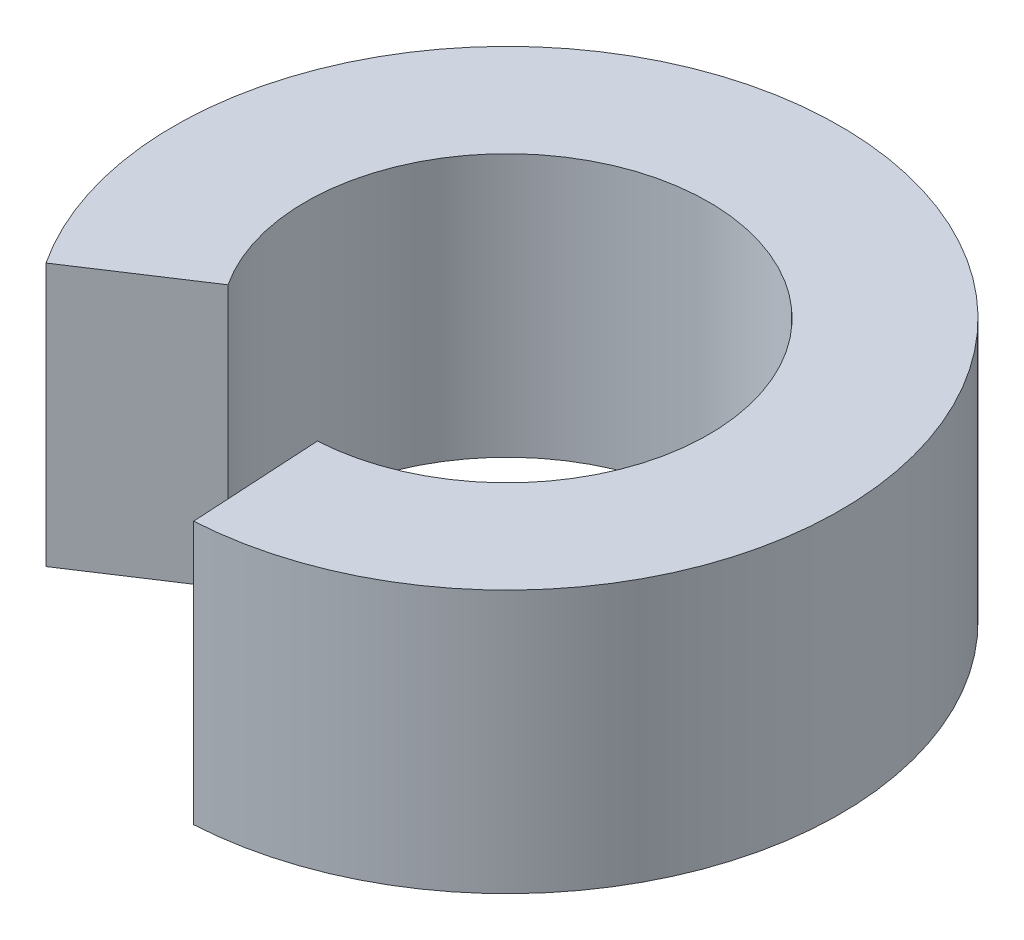
ISO-10303-21;
HEADER;
FILE_DESCRIPTION(('STEP AP214'),'2;1');
FILE_NAME('part.step','',(''),(''),'','','');
FILE_SCHEMA(('AUTOMOTIVE_DESIGN { 1 0 10303 214 1 1 1 1 }'));
ENDSEC;
DATA;
#1=APPLICATION_CONTEXT('core data for automotive mechanical design processes');
#2=APPLICATION_PROTOCOL_DEFINITION('international standard','automotive_design',2000,#1);
#3=PRODUCT_CONTEXT('',#1,'mechanical');
#4=PRODUCT('Part','Part','',(#3));
#5=PRODUCT_RELATED_PRODUCT_CATEGORY('part','',(#4));
#6=PRODUCT_DEFINITION_FORMATION('','',#4);
#7=PRODUCT_DEFINITION_CONTEXT('part definition',#1,'design');
#8=PRODUCT_DEFINITION('design','',#6,#7);
#9=PRODUCT_DEFINITION_SHAPE('','',#8);
#10=(LENGTH_UNIT() NAMED_UNIT(*) SI_UNIT(.MILLI.,.METRE.));
#11=(NAMED_UNIT(*) PLANE_ANGLE_UNIT() SI_UNIT($,.RADIAN.));
#12=(NAMED_UNIT(*) SI_UNIT($,.STERADIAN.) SOLID_ANGLE_UNIT());
#13=UNCERTAINTY_MEASURE_WITH_UNIT(LENGTH_MEASURE(1.E-05),#10,'distance_accuracy_value','');
#14=(GEOMETRIC_REPRESENTATION_CONTEXT(3) GLOBAL_UNCERTAINTY_ASSIGNED_CONTEXT((#13)) GLOBAL_UNIT_ASSIGNED_CONTEXT((#10,
#11,#12)) REPRESENTATION_CONTEXT('',''));
#15=CARTESIAN_POINT('',(0.,0.,0.));
#16=DIRECTION('',(0.,0.,1.));
#17=DIRECTION('',(1.,0.,0.));
#18=AXIS2_PLACEMENT_3D('',#15,#16,#17);
#19=CARTESIAN_POINT('',(0.,3.,0.));
#20=DIRECTION('',(0.,-1.,0.));
#21=DIRECTION('',(0.,0.,-1.));
#22=AXIS2_PLACEMENT_3D('',#19,#20,#21);
#23=CYLINDRICAL_SURFACE('',#22,2.3);
#24=CARTESIAN_POINT('',(0.,0.,0.));
#25=DIRECTION('',(0.,-1.,0.));
#26=DIRECTION('',(0.,0.,-1.));
#27=AXIS2_PLACEMENT_3D('',#24,#25,#26);
#28=CIRCLE('',#27,2.3);
#29=CARTESIAN_POINT('',(-1.92291019492524,0.,1.26190981541969));
#30=VERTEX_POINT('',#29);
#31=CARTESIAN_POINT('',(0.131390859975736,0.,2.2962439857112));
#32=VERTEX_POINT('',#31);
#33=EDGE_CURVE('E96',#30,#32,#28,.T.);
#34=ORIENTED_EDGE('',*,*,#33,.T.);
#35=DIRECTION('',(0.,-1.,0.));
#36=VECTOR('',#35,1.);
#37=CARTESIAN_POINT('',(0.131390859975736,3.,2.2962439857112));
#38=LINE('',#37,#36);
#39=CARTESIAN_POINT('',(0.131390859975736,3.,2.2962439857112));
#40=VERTEX_POINT('',#39);
#41=EDGE_CURVE('E11',#40,#32,#38,.T.);
#42=ORIENTED_EDGE('',*,*,#41,.F.);
#43=CARTESIAN_POINT('',(0.,3.,0.));
#44=DIRECTION('',(0.,-1.,0.));
#45=DIRECTION('',(0.,0.,-1.));
#46=AXIS2_PLACEMENT_3D('',#43,#44,#45);
#47=CIRCLE('',#46,2.3);
#48=CARTESIAN_POINT('',(-1.92291019492524,3.,1.26190981541969));
#49=VERTEX_POINT('',#48);
#50=EDGE_CURVE('E84',#49,#40,#47,.T.);
#51=ORIENTED_EDGE('',*,*,#50,.F.);
#52=DIRECTION('',(0.,-1.,0.));
#53=VECTOR('',#52,1.);
#54=CARTESIAN_POINT('',(-1.92291019492524,3.,1.26190981541969));
#55=LINE('',#54,#53);
#56=EDGE_CURVE('E92',#49,#30,#55,.T.);
#57=ORIENTED_EDGE('',*,*,#56,.T.);
#58=EDGE_LOOP('',(#34,#42,#51,#57));
#59=FACE_BOUND('',#58,.T.);
#60=ADVANCED_FACE('F33',(#59),#23,.F.);
#61=CARTESIAN_POINT('',(0.131390859975736,3.,2.2962439857112));
#62=DIRECTION('',(0.998366950309216,0.,-0.0571264608590143));
#63=DIRECTION('',(-0.0571264608590143,0.,-0.998366950309216));
#64=AXIS2_PLACEMENT_3D('',#61,#62,#63);
#65=PLANE('',#64);
#66=DIRECTION('',(0.0571264608590143,0.,0.998366950309215));
#67=VECTOR('',#66,1.);
#68=CARTESIAN_POINT('',(0.131390859975736,0.,2.2962439857112));
#69=LINE('',#68,#67);
#70=CARTESIAN_POINT('',(0.217080551264259,0.,3.79379441117502));
#71=VERTEX_POINT('',#70);
#72=EDGE_CURVE('E88',#32,#71,#69,.T.);
#73=ORIENTED_EDGE('',*,*,#72,.T.);
#74=DIRECTION('',(0.,-1.,0.));
#75=VECTOR('',#74,1.);
#76=CARTESIAN_POINT('',(0.217080551264259,3.,3.79379441117502));
#77=LINE('',#76,#75);
#78=CARTESIAN_POINT('',(0.217080551264259,3.,3.79379441117502));
#79=VERTEX_POINT('',#78);
#80=EDGE_CURVE('E41',#79,#71,#77,.T.);
#81=ORIENTED_EDGE('',*,*,#80,.F.);
#82=DIRECTION('',(0.0571264608590143,0.,0.998366950309215));
#83=VECTOR('',#82,1.);
#84=CARTESIAN_POINT('',(0.131390859975736,3.,2.2962439857112));
#85=LINE('',#84,#83);
#86=EDGE_CURVE('E79',#40,#79,#85,.T.);
#87=ORIENTED_EDGE('',*,*,#86,.F.);
#88=ORIENTED_EDGE('',*,*,#41,.T.);
#89=EDGE_LOOP('',(#73,#81,#87,#88));
#90=FACE_BOUND('',#89,.T.);
#91=ADVANCED_FACE('F87',(#90),#65,.F.);
#92=CARTESIAN_POINT('',(0.,3.,0.));
#93=DIRECTION('',(0.,-1.,0.));
#94=DIRECTION('',(0.,0.,-1.));
#95=AXIS2_PLACEMENT_3D('',#92,#93,#94);
#96=CYLINDRICAL_SURFACE('',#95,3.8);
#97=CARTESIAN_POINT('',(0.,0.,0.));
#98=DIRECTION('',(0.,1.,0.));
#99=DIRECTION('',(0.,0.,-1.));
#100=AXIS2_PLACEMENT_3D('',#97,#98,#99);
#101=CIRCLE('',#100,3.8);
#102=CARTESIAN_POINT('',(-3.17698206118084,0.,2.08489447764992));
#103=VERTEX_POINT('',#102);
#104=EDGE_CURVE('E66',#71,#103,#101,.T.);
#105=ORIENTED_EDGE('',*,*,#104,.T.);
#106=DIRECTION('',(0.,-1.,0.));
#107=VECTOR('',#106,1.);
#108=CARTESIAN_POINT('',(-3.17698206118084,3.,2.08489447764992));
#109=LINE('',#108,#107);
#110=CARTESIAN_POINT('',(-3.17698206118084,3.,2.08489447764992));
#111=VERTEX_POINT('',#110);
#112=EDGE_CURVE('E89',#111,#103,#109,.T.);
#113=ORIENTED_EDGE('',*,*,#112,.F.);
#114=CARTESIAN_POINT('',(0.,3.,0.));
#115=DIRECTION('',(0.,1.,0.));
#116=DIRECTION('',(0.,0.,-1.));
#117=AXIS2_PLACEMENT_3D('',#114,#115,#116);
#118=CIRCLE('',#117,3.8);
#119=EDGE_CURVE('E82',#79,#111,#118,.T.);
#120=ORIENTED_EDGE('',*,*,#119,.F.);
#121=ORIENTED_EDGE('',*,*,#80,.T.);
#122=EDGE_LOOP('',(#105,#113,#120,#121));
#123=FACE_BOUND('',#122,.T.);
#124=ADVANCED_FACE('F90',(#123),#96,.T.);
#125=CARTESIAN_POINT('',(-1.92291019492524,3.,1.26190981541969));
#126=DIRECTION('',(-0.548656441486821,0.,-0.836047910837063));
#127=DIRECTION('',(-0.836047910837063,0.,0.548656441486821));
#128=AXIS2_PLACEMENT_3D('',#125,#126,#127);
#129=PLANE('',#128);
#130=DIRECTION('',(0.836047910837063,0.,-0.548656441486821));
#131=VECTOR('',#130,1.);
#132=CARTESIAN_POINT('',(-1.92291019492524,0.,1.26190981541969));
#133=LINE('',#132,#131);
#134=EDGE_CURVE('E72',#103,#30,#133,.T.);
#135=ORIENTED_EDGE('',*,*,#134,.T.);
#136=ORIENTED_EDGE('',*,*,#56,.F.);
#137=DIRECTION('',(0.836047910837063,0.,-0.548656441486821));
#138=VECTOR('',#137,1.);
#139=CARTESIAN_POINT('',(-1.92291019492524,3.,1.26190981541969));
#140=LINE('',#139,#138);
#141=EDGE_CURVE('E49',#111,#49,#140,.T.);
#142=ORIENTED_EDGE('',*,*,#141,.F.);
#143=ORIENTED_EDGE('',*,*,#112,.T.);
#144=EDGE_LOOP('',(#135,#136,#142,#143));
#145=FACE_BOUND('',#144,.T.);
#146=ADVANCED_FACE('F103',(#145),#129,.F.);
#147=CARTESIAN_POINT('',(0.,3.,0.));
#148=DIRECTION('',(0.,-1.,0.));
#149=DIRECTION('',(0.,0.,-1.));
#150=AXIS2_PLACEMENT_3D('',#147,#148,#149);
#151=PLANE('',#150);
#152=ORIENTED_EDGE('',*,*,#50,.T.);
#153=ORIENTED_EDGE('',*,*,#86,.T.);
#154=ORIENTED_EDGE('',*,*,#119,.T.);
#155=ORIENTED_EDGE('',*,*,#141,.T.);
#156=EDGE_LOOP('',(#152,#153,#154,#155));
#157=FACE_BOUND('',#156,.T.);
#158=ADVANCED_FACE('F80',(#157),#151,.F.);
#159=CARTESIAN_POINT('',(0.,0.,0.));
#160=DIRECTION('',(0.,-1.,0.));
#161=DIRECTION('',(0.,0.,-1.));
#162=AXIS2_PLACEMENT_3D('',#159,#160,#161);
#163=PLANE('',#162);
#164=ORIENTED_EDGE('',*,*,#33,.F.);
#165=ORIENTED_EDGE('',*,*,#134,.F.);
#166=ORIENTED_EDGE('',*,*,#104,.F.);
#167=ORIENTED_EDGE('',*,*,#72,.F.);
#168=EDGE_LOOP('',(#164,#165,#166,#167));
#169=FACE_BOUND('',#168,.T.);
#170=ADVANCED_FACE('F106',(#169),#163,.T.);
#171=CLOSED_SHELL('',(#60,#91,#124,#146,#158,#170));
#172=MANIFOLD_SOLID_BREP('B2',#171);
#173=ADVANCED_BREP_SHAPE_REPRESENTATION('',(#18,#172),#14);
#174=SHAPE_DEFINITION_REPRESENTATION(#9,#173);
ENDSEC;
END-ISO-10303-21;
